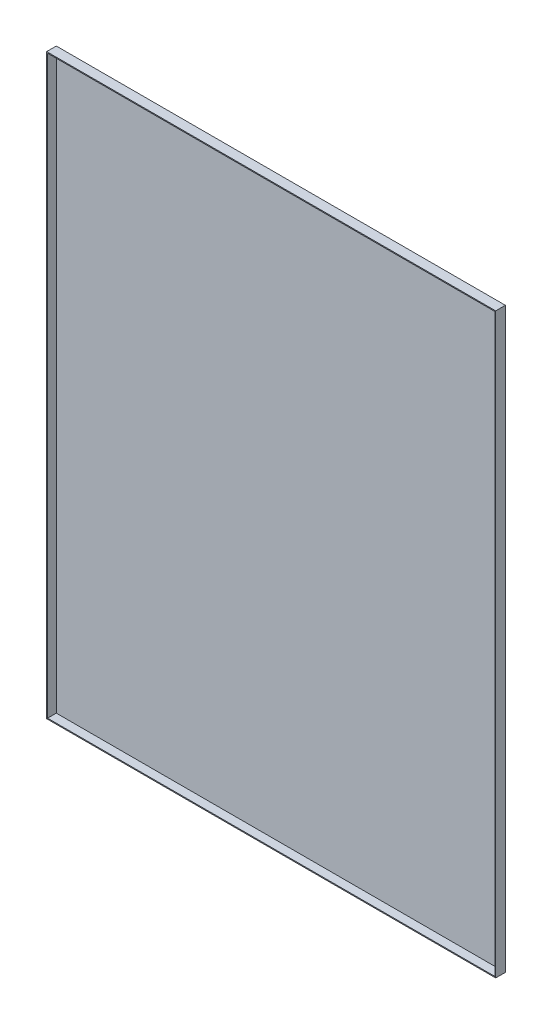
ISO-10303-21;
HEADER;
FILE_DESCRIPTION(('STEP AP214'),'2;1');
FILE_NAME('part.step','',(''),(''),'','','');
FILE_SCHEMA(('AUTOMOTIVE_DESIGN { 1 0 10303 214 1 1 1 1 }'));
ENDSEC;
DATA;
#1=APPLICATION_CONTEXT('core data for automotive mechanical design processes');
#2=APPLICATION_PROTOCOL_DEFINITION('international standard','automotive_design',2000,#1);
#3=PRODUCT_CONTEXT('',#1,'mechanical');
#4=PRODUCT('Part','Part','',(#3));
#5=PRODUCT_RELATED_PRODUCT_CATEGORY('part','',(#4));
#6=PRODUCT_DEFINITION_FORMATION('','',#4);
#7=PRODUCT_DEFINITION_CONTEXT('part definition',#1,'design');
#8=PRODUCT_DEFINITION('design','',#6,#7);
#9=PRODUCT_DEFINITION_SHAPE('','',#8);
#10=(LENGTH_UNIT() NAMED_UNIT(*) SI_UNIT(.MILLI.,.METRE.));
#11=(NAMED_UNIT(*) PLANE_ANGLE_UNIT() SI_UNIT($,.RADIAN.));
#12=(NAMED_UNIT(*) SI_UNIT($,.STERADIAN.) SOLID_ANGLE_UNIT());
#13=UNCERTAINTY_MEASURE_WITH_UNIT(LENGTH_MEASURE(1.E-05),#10,'distance_accuracy_value','');
#14=(GEOMETRIC_REPRESENTATION_CONTEXT(3) GLOBAL_UNCERTAINTY_ASSIGNED_CONTEXT((#13)) GLOBAL_UNIT_ASSIGNED_CONTEXT((#10,
#11,#12)) REPRESENTATION_CONTEXT('',''));
#15=CARTESIAN_POINT('',(0.,0.,0.));
#16=DIRECTION('',(0.,0.,1.));
#17=DIRECTION('',(1.,0.,0.));
#18=AXIS2_PLACEMENT_3D('',#15,#16,#17);
#19=CARTESIAN_POINT('',(-349.,449.,1965.));
#20=DIRECTION('',(-1.,0.,0.));
#21=DIRECTION('',(0.,-1.,0.));
#22=AXIS2_PLACEMENT_3D('',#19,#20,#21);
#23=PLANE('',#22);
#24=DIRECTION('',(0.,1.,0.));
#25=VECTOR('',#24,1.);
#26=CARTESIAN_POINT('',(-349.,449.,1950.));
#27=LINE('',#26,#25);
#28=CARTESIAN_POINT('',(-349.,-449.,1950.));
#29=VERTEX_POINT('',#28);
#30=CARTESIAN_POINT('',(-349.,449.,1950.));
#31=VERTEX_POINT('',#30);
#32=EDGE_CURVE('E123',#29,#31,#27,.T.);
#33=ORIENTED_EDGE('',*,*,#32,.F.);
#34=DIRECTION('',(0.,0.,-1.));
#35=VECTOR('',#34,1.);
#36=CARTESIAN_POINT('',(-349.,-449.,1965.));
#37=LINE('',#36,#35);
#38=CARTESIAN_POINT('',(-349.,-449.,1965.));
#39=VERTEX_POINT('',#38);
#40=EDGE_CURVE('E11',#39,#29,#37,.T.);
#41=ORIENTED_EDGE('',*,*,#40,.F.);
#42=DIRECTION('',(0.,1.,0.));
#43=VECTOR('',#42,1.);
#44=CARTESIAN_POINT('',(-349.,449.,1965.));
#45=LINE('',#44,#43);
#46=CARTESIAN_POINT('',(-349.,449.,1965.));
#47=VERTEX_POINT('',#46);
#48=EDGE_CURVE('E125',#39,#47,#45,.T.);
#49=ORIENTED_EDGE('',*,*,#48,.T.);
#50=DIRECTION('',(0.,0.,-1.));
#51=VECTOR('',#50,1.);
#52=CARTESIAN_POINT('',(-349.,449.,1965.));
#53=LINE('',#52,#51);
#54=EDGE_CURVE('E20',#47,#31,#53,.T.);
#55=ORIENTED_EDGE('',*,*,#54,.T.);
#56=EDGE_LOOP('',(#33,#41,#49,#55));
#57=FACE_BOUND('',#56,.T.);
#58=ADVANCED_FACE('F17',(#57),#23,.T.);
#59=CARTESIAN_POINT('',(-349.,-449.,1965.));
#60=DIRECTION('',(0.,-1.,0.));
#61=DIRECTION('',(1.,0.,0.));
#62=AXIS2_PLACEMENT_3D('',#59,#60,#61);
#63=PLANE('',#62);
#64=DIRECTION('',(-1.,0.,0.));
#65=VECTOR('',#64,1.);
#66=CARTESIAN_POINT('',(-349.,-449.,1950.));
#67=LINE('',#66,#65);
#68=CARTESIAN_POINT('',(349.,-449.,1950.));
#69=VERTEX_POINT('',#68);
#70=EDGE_CURVE('E128',#69,#29,#67,.T.);
#71=ORIENTED_EDGE('',*,*,#70,.F.);
#72=DIRECTION('',(0.,0.,-1.));
#73=VECTOR('',#72,1.);
#74=CARTESIAN_POINT('',(349.,-449.,1965.));
#75=LINE('',#74,#73);
#76=CARTESIAN_POINT('',(349.,-449.,1965.));
#77=VERTEX_POINT('',#76);
#78=EDGE_CURVE('E25',#77,#69,#75,.T.);
#79=ORIENTED_EDGE('',*,*,#78,.F.);
#80=DIRECTION('',(-1.,0.,0.));
#81=VECTOR('',#80,1.);
#82=CARTESIAN_POINT('',(-349.,-449.,1965.));
#83=LINE('',#82,#81);
#84=EDGE_CURVE('E133',#77,#39,#83,.T.);
#85=ORIENTED_EDGE('',*,*,#84,.T.);
#86=ORIENTED_EDGE('',*,*,#40,.T.);
#87=EDGE_LOOP('',(#71,#79,#85,#86));
#88=FACE_BOUND('',#87,.T.);
#89=ADVANCED_FACE('F150',(#88),#63,.T.);
#90=CARTESIAN_POINT('',(349.,449.,1965.));
#91=DIRECTION('',(1.,0.,0.));
#92=DIRECTION('',(0.,1.,0.));
#93=AXIS2_PLACEMENT_3D('',#90,#91,#92);
#94=PLANE('',#93);
#95=DIRECTION('',(0.,-1.,0.));
#96=VECTOR('',#95,1.);
#97=CARTESIAN_POINT('',(349.,449.,1950.));
#98=LINE('',#97,#96);
#99=CARTESIAN_POINT('',(349.,449.,1950.));
#100=VERTEX_POINT('',#99);
#101=EDGE_CURVE('E140',#100,#69,#98,.T.);
#102=ORIENTED_EDGE('',*,*,#101,.F.);
#103=DIRECTION('',(0.,0.,-1.));
#104=VECTOR('',#103,1.);
#105=CARTESIAN_POINT('',(349.,449.,1965.));
#106=LINE('',#105,#104);
#107=CARTESIAN_POINT('',(349.,449.,1965.));
#108=VERTEX_POINT('',#107);
#109=EDGE_CURVE('E145',#108,#100,#106,.T.);
#110=ORIENTED_EDGE('',*,*,#109,.F.);
#111=DIRECTION('',(0.,-1.,0.));
#112=VECTOR('',#111,1.);
#113=CARTESIAN_POINT('',(349.,449.,1965.));
#114=LINE('',#113,#112);
#115=EDGE_CURVE('E130',#108,#77,#114,.T.);
#116=ORIENTED_EDGE('',*,*,#115,.T.);
#117=ORIENTED_EDGE('',*,*,#78,.T.);
#118=EDGE_LOOP('',(#102,#110,#116,#117));
#119=FACE_BOUND('',#118,.T.);
#120=ADVANCED_FACE('F154',(#119),#94,.T.);
#121=CARTESIAN_POINT('',(-349.,449.,1965.));
#122=DIRECTION('',(0.,1.,0.));
#123=DIRECTION('',(-1.,0.,0.));
#124=AXIS2_PLACEMENT_3D('',#121,#122,#123);
#125=PLANE('',#124);
#126=DIRECTION('',(1.,0.,0.));
#127=VECTOR('',#126,1.);
#128=CARTESIAN_POINT('',(-349.,449.,1950.));
#129=LINE('',#128,#127);
#130=EDGE_CURVE('E137',#31,#100,#129,.T.);
#131=ORIENTED_EDGE('',*,*,#130,.F.);
#132=ORIENTED_EDGE('',*,*,#54,.F.);
#133=DIRECTION('',(1.,0.,0.));
#134=VECTOR('',#133,1.);
#135=CARTESIAN_POINT('',(-349.,449.,1965.));
#136=LINE('',#135,#134);
#137=EDGE_CURVE('E127',#47,#108,#136,.T.);
#138=ORIENTED_EDGE('',*,*,#137,.T.);
#139=ORIENTED_EDGE('',*,*,#109,.T.);
#140=EDGE_LOOP('',(#131,#132,#138,#139));
#141=FACE_BOUND('',#140,.T.);
#142=ADVANCED_FACE('F147',(#141),#125,.T.);
#143=CARTESIAN_POINT('',(0.,0.,1965.));
#144=DIRECTION('',(0.,0.,1.));
#145=DIRECTION('',(1.,0.,0.));
#146=AXIS2_PLACEMENT_3D('',#143,#144,#145);
#147=PLANE('',#146);
#148=DIRECTION('',(-1.,0.,0.));
#149=VECTOR('',#148,1.);
#150=CARTESIAN_POINT('',(347.5,447.5,1965.));
#151=LINE('',#150,#149);
#152=CARTESIAN_POINT('',(347.5,447.5,1965.));
#153=VERTEX_POINT('',#152);
#154=CARTESIAN_POINT('',(-347.5,447.5,1965.));
#155=VERTEX_POINT('',#154);
#156=EDGE_CURVE('E33',#153,#155,#151,.T.);
#157=ORIENTED_EDGE('',*,*,#156,.F.);
#158=DIRECTION('',(0.,1.,0.));
#159=VECTOR('',#158,1.);
#160=CARTESIAN_POINT('',(347.5,-447.5,1965.));
#161=LINE('',#160,#159);
#162=CARTESIAN_POINT('',(347.5,-447.5,1965.));
#163=VERTEX_POINT('',#162);
#164=EDGE_CURVE('E112',#163,#153,#161,.T.);
#165=ORIENTED_EDGE('',*,*,#164,.F.);
#166=DIRECTION('',(1.,0.,0.));
#167=VECTOR('',#166,1.);
#168=CARTESIAN_POINT('',(-347.5,-447.5,1965.));
#169=LINE('',#168,#167);
#170=CARTESIAN_POINT('',(-347.5,-447.5,1965.));
#171=VERTEX_POINT('',#170);
#172=EDGE_CURVE('E95',#171,#163,#169,.T.);
#173=ORIENTED_EDGE('',*,*,#172,.F.);
#174=DIRECTION('',(0.,-1.,0.));
#175=VECTOR('',#174,1.);
#176=CARTESIAN_POINT('',(-347.5,447.5,1965.));
#177=LINE('',#176,#175);
#178=EDGE_CURVE('E105',#155,#171,#177,.T.);
#179=ORIENTED_EDGE('',*,*,#178,.F.);
#180=EDGE_LOOP('',(#157,#165,#173,#179));
#181=FACE_BOUND('',#180,.T.);
#182=ORIENTED_EDGE('',*,*,#48,.F.);
#183=ORIENTED_EDGE('',*,*,#84,.F.);
#184=ORIENTED_EDGE('',*,*,#115,.F.);
#185=ORIENTED_EDGE('',*,*,#137,.F.);
#186=EDGE_LOOP('',(#182,#183,#184,#185));
#187=FACE_BOUND('',#186,.T.);
#188=ADVANCED_FACE('F109',(#181,#187),#147,.T.);
#189=CARTESIAN_POINT('',(0.,0.,1950.));
#190=DIRECTION('',(0.,0.,1.));
#191=DIRECTION('',(1.,0.,0.));
#192=AXIS2_PLACEMENT_3D('',#189,#190,#191);
#193=PLANE('',#192);
#194=ORIENTED_EDGE('',*,*,#32,.T.);
#195=ORIENTED_EDGE('',*,*,#130,.T.);
#196=ORIENTED_EDGE('',*,*,#101,.T.);
#197=ORIENTED_EDGE('',*,*,#70,.T.);
#198=EDGE_LOOP('',(#194,#195,#196,#197));
#199=FACE_BOUND('',#198,.T.);
#200=ADVANCED_FACE('F149',(#199),#193,.F.);
#201=CARTESIAN_POINT('',(347.5,447.5,816.84069963663));
#202=DIRECTION('',(0.,1.,0.));
#203=DIRECTION('',(-1.,0.,0.));
#204=AXIS2_PLACEMENT_3D('',#201,#202,#203);
#205=PLANE('',#204);
#206=DIRECTION('',(1.,0.,0.));
#207=VECTOR('',#206,1.);
#208=CARTESIAN_POINT('',(347.5,447.5,1951.5));
#209=LINE('',#208,#207);
#210=CARTESIAN_POINT('',(-347.5,447.5,1951.5));
#211=VERTEX_POINT('',#210);
#212=CARTESIAN_POINT('',(347.5,447.5,1951.5));
#213=VERTEX_POINT('',#212);
#214=EDGE_CURVE('E124',#211,#213,#209,.T.);
#215=ORIENTED_EDGE('',*,*,#214,.T.);
#216=DIRECTION('',(0.,0.,1.));
#217=VECTOR('',#216,1.);
#218=CARTESIAN_POINT('',(347.5,447.5,816.84069963663));
#219=LINE('',#218,#217);
#220=EDGE_CURVE('E117',#213,#153,#219,.T.);
#221=ORIENTED_EDGE('',*,*,#220,.T.);
#222=ORIENTED_EDGE('',*,*,#156,.T.);
#223=DIRECTION('',(0.,0.,1.));
#224=VECTOR('',#223,1.);
#225=CARTESIAN_POINT('',(-347.5,447.5,816.84069963663));
#226=LINE('',#225,#224);
#227=EDGE_CURVE('E102',#211,#155,#226,.T.);
#228=ORIENTED_EDGE('',*,*,#227,.F.);
#229=EDGE_LOOP('',(#215,#221,#222,#228));
#230=FACE_BOUND('',#229,.T.);
#231=ADVANCED_FACE('F162',(#230),#205,.F.);
#232=CARTESIAN_POINT('',(347.5,-447.5,816.84069963663));
#233=DIRECTION('',(1.,0.,0.));
#234=DIRECTION('',(0.,1.,0.));
#235=AXIS2_PLACEMENT_3D('',#232,#233,#234);
#236=PLANE('',#235);
#237=DIRECTION('',(0.,-1.,0.));
#238=VECTOR('',#237,1.);
#239=CARTESIAN_POINT('',(347.5,-447.5,1951.5));
#240=LINE('',#239,#238);
#241=CARTESIAN_POINT('',(347.5,-447.5,1951.5));
#242=VERTEX_POINT('',#241);
#243=EDGE_CURVE('E248',#213,#242,#240,.T.);
#244=ORIENTED_EDGE('',*,*,#243,.T.);
#245=DIRECTION('',(0.,0.,1.));
#246=VECTOR('',#245,1.);
#247=CARTESIAN_POINT('',(347.5,-447.5,816.84069963663));
#248=LINE('',#247,#246);
#249=EDGE_CURVE('E101',#242,#163,#248,.T.);
#250=ORIENTED_EDGE('',*,*,#249,.T.);
#251=ORIENTED_EDGE('',*,*,#164,.T.);
#252=ORIENTED_EDGE('',*,*,#220,.F.);
#253=EDGE_LOOP('',(#244,#250,#251,#252));
#254=FACE_BOUND('',#253,.T.);
#255=ADVANCED_FACE('F207',(#254),#236,.F.);
#256=CARTESIAN_POINT('',(-347.5,-447.5,816.84069963663));
#257=DIRECTION('',(0.,-1.,0.));
#258=DIRECTION('',(1.,0.,0.));
#259=AXIS2_PLACEMENT_3D('',#256,#257,#258);
#260=PLANE('',#259);
#261=DIRECTION('',(-1.,0.,0.));
#262=VECTOR('',#261,1.);
#263=CARTESIAN_POINT('',(-347.5,-447.5,1951.5));
#264=LINE('',#263,#262);
#265=CARTESIAN_POINT('',(-347.5,-447.5,1951.5));
#266=VERTEX_POINT('',#265);
#267=EDGE_CURVE('E98',#242,#266,#264,.T.);
#268=ORIENTED_EDGE('',*,*,#267,.T.);
#269=DIRECTION('',(0.,0.,1.));
#270=VECTOR('',#269,1.);
#271=CARTESIAN_POINT('',(-347.5,-447.5,816.84069963663));
#272=LINE('',#271,#270);
#273=EDGE_CURVE('E90',#266,#171,#272,.T.);
#274=ORIENTED_EDGE('',*,*,#273,.T.);
#275=ORIENTED_EDGE('',*,*,#172,.T.);
#276=ORIENTED_EDGE('',*,*,#249,.F.);
#277=EDGE_LOOP('',(#268,#274,#275,#276));
#278=FACE_BOUND('',#277,.T.);
#279=ADVANCED_FACE('F92',(#278),#260,.F.);
#280=CARTESIAN_POINT('',(-347.5,447.5,816.84069963663));
#281=DIRECTION('',(-1.,0.,0.));
#282=DIRECTION('',(0.,-1.,0.));
#283=AXIS2_PLACEMENT_3D('',#280,#281,#282);
#284=PLANE('',#283);
#285=DIRECTION('',(0.,1.,0.));
#286=VECTOR('',#285,1.);
#287=CARTESIAN_POINT('',(-347.5,447.5,1951.5));
#288=LINE('',#287,#286);
#289=EDGE_CURVE('E121',#266,#211,#288,.T.);
#290=ORIENTED_EDGE('',*,*,#289,.T.);
#291=ORIENTED_EDGE('',*,*,#227,.T.);
#292=ORIENTED_EDGE('',*,*,#178,.T.);
#293=ORIENTED_EDGE('',*,*,#273,.F.);
#294=EDGE_LOOP('',(#290,#291,#292,#293));
#295=FACE_BOUND('',#294,.T.);
#296=ADVANCED_FACE('F106',(#295),#284,.F.);
#297=CARTESIAN_POINT('',(0.,0.,1951.5));
#298=DIRECTION('',(0.,0.,1.));
#299=DIRECTION('',(1.,0.,0.));
#300=AXIS2_PLACEMENT_3D('',#297,#298,#299);
#301=PLANE('',#300);
#302=ORIENTED_EDGE('',*,*,#214,.F.);
#303=ORIENTED_EDGE('',*,*,#289,.F.);
#304=ORIENTED_EDGE('',*,*,#267,.F.);
#305=ORIENTED_EDGE('',*,*,#243,.F.);
#306=EDGE_LOOP('',(#302,#303,#304,#305));
#307=FACE_BOUND('',#306,.T.);
#308=ADVANCED_FACE('F232',(#307),#301,.T.);
#309=CLOSED_SHELL('',(#58,#89,#120,#142,#188,#200,#231,#255,#279,#296,#308));
#310=MANIFOLD_SOLID_BREP('B1',#309);
#311=ADVANCED_BREP_SHAPE_REPRESENTATION('',(#18,#310),#14);
#312=SHAPE_DEFINITION_REPRESENTATION(#9,#311);
ENDSEC;
END-ISO-10303-21;
